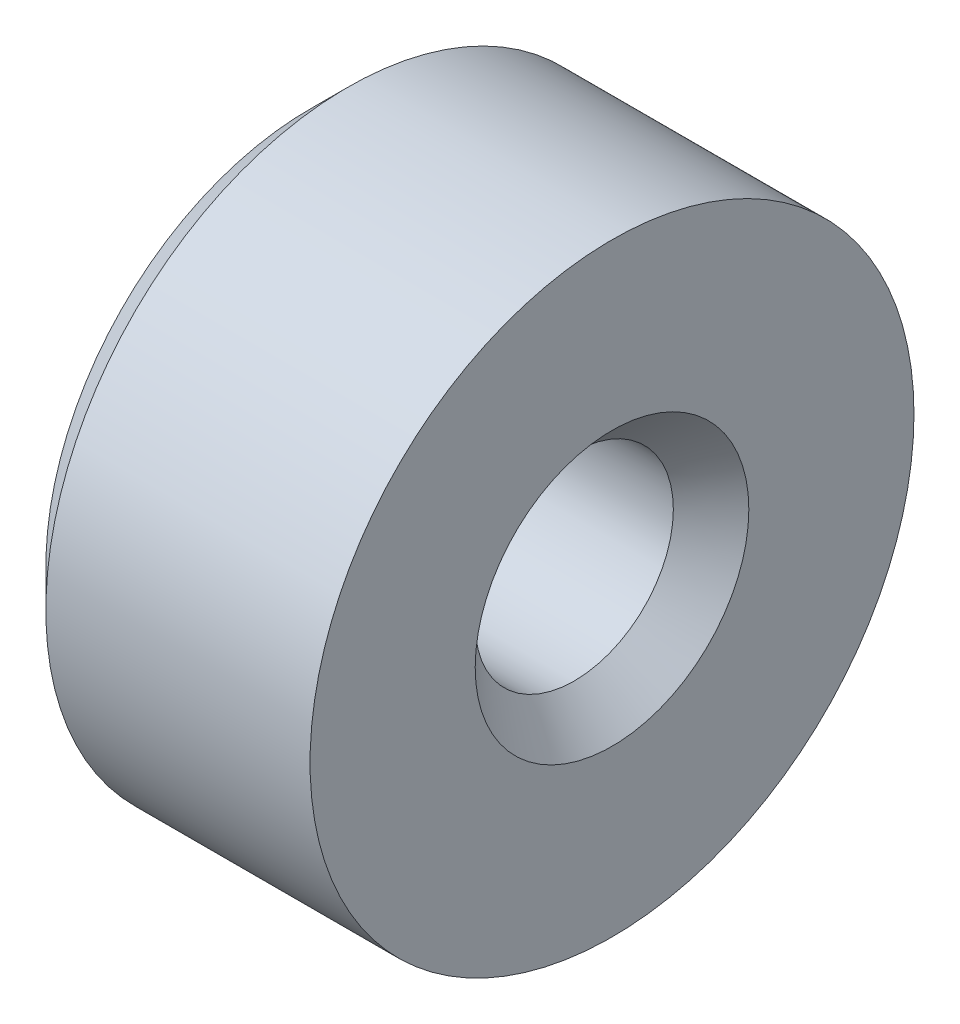
ISO-10303-21;
HEADER;
FILE_DESCRIPTION(('STEP AP214'),'2;1');
FILE_NAME('part.step','',(''),(''),'','','');
FILE_SCHEMA(('AUTOMOTIVE_DESIGN { 1 0 10303 214 1 1 1 1 }'));
ENDSEC;
DATA;
#1=APPLICATION_CONTEXT('core data for automotive mechanical design processes');
#2=APPLICATION_PROTOCOL_DEFINITION('international standard','automotive_design',2000,#1);
#3=PRODUCT_CONTEXT('',#1,'mechanical');
#4=PRODUCT('Part','Part','',(#3));
#5=PRODUCT_RELATED_PRODUCT_CATEGORY('part','',(#4));
#6=PRODUCT_DEFINITION_FORMATION('','',#4);
#7=PRODUCT_DEFINITION_CONTEXT('part definition',#1,'design');
#8=PRODUCT_DEFINITION('design','',#6,#7);
#9=PRODUCT_DEFINITION_SHAPE('','',#8);
#10=(LENGTH_UNIT() NAMED_UNIT(*) SI_UNIT(.MILLI.,.METRE.));
#11=(NAMED_UNIT(*) PLANE_ANGLE_UNIT() SI_UNIT($,.RADIAN.));
#12=(NAMED_UNIT(*) SI_UNIT($,.STERADIAN.) SOLID_ANGLE_UNIT());
#13=UNCERTAINTY_MEASURE_WITH_UNIT(LENGTH_MEASURE(1.E-05),#10,'distance_accuracy_value','');
#14=(GEOMETRIC_REPRESENTATION_CONTEXT(3) GLOBAL_UNCERTAINTY_ASSIGNED_CONTEXT((#13)) GLOBAL_UNIT_ASSIGNED_CONTEXT((#10,
#11,#12)) REPRESENTATION_CONTEXT('',''));
#15=CARTESIAN_POINT('',(0.,0.,0.));
#16=DIRECTION('',(0.,0.,1.));
#17=DIRECTION('',(1.,0.,0.));
#18=AXIS2_PLACEMENT_3D('',#15,#16,#17);
#19=CARTESIAN_POINT('',(8.,0.,0.));
#20=DIRECTION('',(1.,0.,0.));
#21=DIRECTION('',(0.,0.,-1.));
#22=AXIS2_PLACEMENT_3D('',#19,#20,#21);
#23=PLANE('',#22);
#24=CARTESIAN_POINT('',(8.,0.,0.));
#25=DIRECTION('',(1.,0.,0.));
#26=DIRECTION('',(0.,0.,-1.));
#27=AXIS2_PLACEMENT_3D('',#24,#25,#26);
#28=CIRCLE('',#27,3.62500000000001);
#29=CARTESIAN_POINT('',(8.,0.,-3.62500000000001));
#30=VERTEX_POINT('',#29);
#31=EDGE_CURVE('E63',#30,#30,#28,.F.);
#32=ORIENTED_EDGE('',*,*,#31,.T.);
#33=EDGE_LOOP('',(#32));
#34=FACE_BOUND('',#33,.T.);
#35=CARTESIAN_POINT('',(8.,0.,0.));
#36=DIRECTION('',(1.,0.,0.));
#37=DIRECTION('',(0.,0.,-1.));
#38=AXIS2_PLACEMENT_3D('',#35,#36,#37);
#39=CIRCLE('',#38,8.);
#40=CARTESIAN_POINT('',(8.,0.,-8.));
#41=VERTEX_POINT('',#40);
#42=EDGE_CURVE('E80',#41,#41,#39,.T.);
#43=ORIENTED_EDGE('',*,*,#42,.T.);
#44=EDGE_LOOP('',(#43));
#45=FACE_BOUND('',#44,.T.);
#46=ADVANCED_FACE('F44',(#34,#45),#23,.T.);
#47=CARTESIAN_POINT('',(0.,0.,0.));
#48=DIRECTION('',(1.,0.,0.));
#49=DIRECTION('',(0.,0.,-1.));
#50=AXIS2_PLACEMENT_3D('',#47,#48,#49);
#51=PLANE('',#50);
#52=CARTESIAN_POINT('',(0.,0.,0.));
#53=DIRECTION('',(1.,0.,0.));
#54=DIRECTION('',(0.,0.,-1.));
#55=AXIS2_PLACEMENT_3D('',#52,#53,#54);
#56=CIRCLE('',#55,6.99999999999999);
#57=CARTESIAN_POINT('',(0.,0.,-6.99999999999999));
#58=VERTEX_POINT('',#57);
#59=EDGE_CURVE('E10',#58,#58,#56,.F.);
#60=ORIENTED_EDGE('',*,*,#59,.T.);
#61=EDGE_LOOP('',(#60));
#62=FACE_BOUND('',#61,.T.);
#63=CARTESIAN_POINT('',(0.,0.,0.));
#64=DIRECTION('',(1.,0.,0.));
#65=DIRECTION('',(0.,0.,-1.));
#66=AXIS2_PLACEMENT_3D('',#63,#64,#65);
#67=CIRCLE('',#66,3.625);
#68=CARTESIAN_POINT('',(0.,0.,-3.625));
#69=VERTEX_POINT('',#68);
#70=EDGE_CURVE('E56',#69,#69,#67,.T.);
#71=ORIENTED_EDGE('',*,*,#70,.T.);
#72=EDGE_LOOP('',(#71));
#73=FACE_BOUND('',#72,.T.);
#74=ADVANCED_FACE('F87',(#62,#73),#51,.F.);
#75=CARTESIAN_POINT('',(8.,0.,0.));
#76=DIRECTION('',(-1.,0.,0.));
#77=DIRECTION('',(0.,0.,1.));
#78=AXIS2_PLACEMENT_3D('',#75,#76,#77);
#79=CYLINDRICAL_SURFACE('',#78,8.);
#80=CARTESIAN_POINT('',(1.,0.,0.));
#81=DIRECTION('',(1.,0.,0.));
#82=DIRECTION('',(0.,0.,-1.));
#83=AXIS2_PLACEMENT_3D('',#80,#81,#82);
#84=CIRCLE('',#83,8.);
#85=CARTESIAN_POINT('',(1.,0.,-8.));
#86=VERTEX_POINT('',#85);
#87=EDGE_CURVE('E53',#86,#86,#84,.T.);
#88=ORIENTED_EDGE('',*,*,#87,.T.);
#89=EDGE_LOOP('',(#88));
#90=FACE_BOUND('',#89,.T.);
#91=ORIENTED_EDGE('',*,*,#42,.F.);
#92=EDGE_LOOP('',(#91));
#93=FACE_BOUND('',#92,.T.);
#94=ADVANCED_FACE('F82',(#90,#93),#79,.T.);
#95=CARTESIAN_POINT('',(8.,0.,0.));
#96=DIRECTION('',(-1.,0.,0.));
#97=DIRECTION('',(0.,0.,1.));
#98=AXIS2_PLACEMENT_3D('',#95,#96,#97);
#99=CYLINDRICAL_SURFACE('',#98,2.625);
#100=CARTESIAN_POINT('',(7.,0.,0.));
#101=DIRECTION('',(1.,0.,0.));
#102=DIRECTION('',(0.,0.,-1.));
#103=AXIS2_PLACEMENT_3D('',#100,#101,#102);
#104=CIRCLE('',#103,2.625);
#105=CARTESIAN_POINT('',(7.,0.,-2.625));
#106=VERTEX_POINT('',#105);
#107=EDGE_CURVE('E69',#106,#106,#104,.T.);
#108=ORIENTED_EDGE('',*,*,#107,.T.);
#109=EDGE_LOOP('',(#108));
#110=FACE_BOUND('',#109,.T.);
#111=CARTESIAN_POINT('',(1.00000000000001,0.,0.));
#112=DIRECTION('',(1.,0.,0.));
#113=DIRECTION('',(0.,0.,-1.));
#114=AXIS2_PLACEMENT_3D('',#111,#112,#113);
#115=CIRCLE('',#114,2.625);
#116=CARTESIAN_POINT('',(1.00000000000001,0.,-2.625));
#117=VERTEX_POINT('',#116);
#118=EDGE_CURVE('E74',#117,#117,#115,.F.);
#119=ORIENTED_EDGE('',*,*,#118,.T.);
#120=EDGE_LOOP('',(#119));
#121=FACE_BOUND('',#120,.T.);
#122=ADVANCED_FACE('F88',(#110,#121),#99,.F.);
#123=CARTESIAN_POINT('',(7.,0.,0.));
#124=DIRECTION('',(1.,0.,0.));
#125=DIRECTION('',(0.,0.,-1.));
#126=AXIS2_PLACEMENT_3D('',#123,#124,#125);
#127=CONICAL_SURFACE('',#126,2.625,0.78539816339745);
#128=ORIENTED_EDGE('',*,*,#31,.F.);
#129=EDGE_LOOP('',(#128));
#130=FACE_BOUND('',#129,.T.);
#131=ORIENTED_EDGE('',*,*,#107,.F.);
#132=EDGE_LOOP('',(#131));
#133=FACE_BOUND('',#132,.T.);
#134=ADVANCED_FACE('F94',(#130,#133),#127,.F.);
#135=CARTESIAN_POINT('',(0.,0.,0.));
#136=DIRECTION('',(-1.,0.,0.));
#137=DIRECTION('',(0.,0.,1.));
#138=AXIS2_PLACEMENT_3D('',#135,#136,#137);
#139=CONICAL_SURFACE('',#138,3.625,0.785398163397446);
#140=ORIENTED_EDGE('',*,*,#118,.F.);
#141=EDGE_LOOP('',(#140));
#142=FACE_BOUND('',#141,.T.);
#143=ORIENTED_EDGE('',*,*,#70,.F.);
#144=EDGE_LOOP('',(#143));
#145=FACE_BOUND('',#144,.T.);
#146=ADVANCED_FACE('F107',(#142,#145),#139,.F.);
#147=CARTESIAN_POINT('',(1.,0.,0.));
#148=DIRECTION('',(1.,0.,0.));
#149=DIRECTION('',(0.,0.,-1.));
#150=AXIS2_PLACEMENT_3D('',#147,#148,#149);
#151=CONICAL_SURFACE('',#150,8.,0.78539816339745);
#152=ORIENTED_EDGE('',*,*,#59,.F.);
#153=EDGE_LOOP('',(#152));
#154=FACE_BOUND('',#153,.T.);
#155=ORIENTED_EDGE('',*,*,#87,.F.);
#156=EDGE_LOOP('',(#155));
#157=FACE_BOUND('',#156,.T.);
#158=ADVANCED_FACE('F48',(#154,#157),#151,.T.);
#159=CLOSED_SHELL('',(#46,#74,#94,#122,#134,#146,#158));
#160=MANIFOLD_SOLID_BREP('B2',#159);
#161=ADVANCED_BREP_SHAPE_REPRESENTATION('',(#18,#160),#14);
#162=SHAPE_DEFINITION_REPRESENTATION(#9,#161);
ENDSEC;
END-ISO-10303-21;
